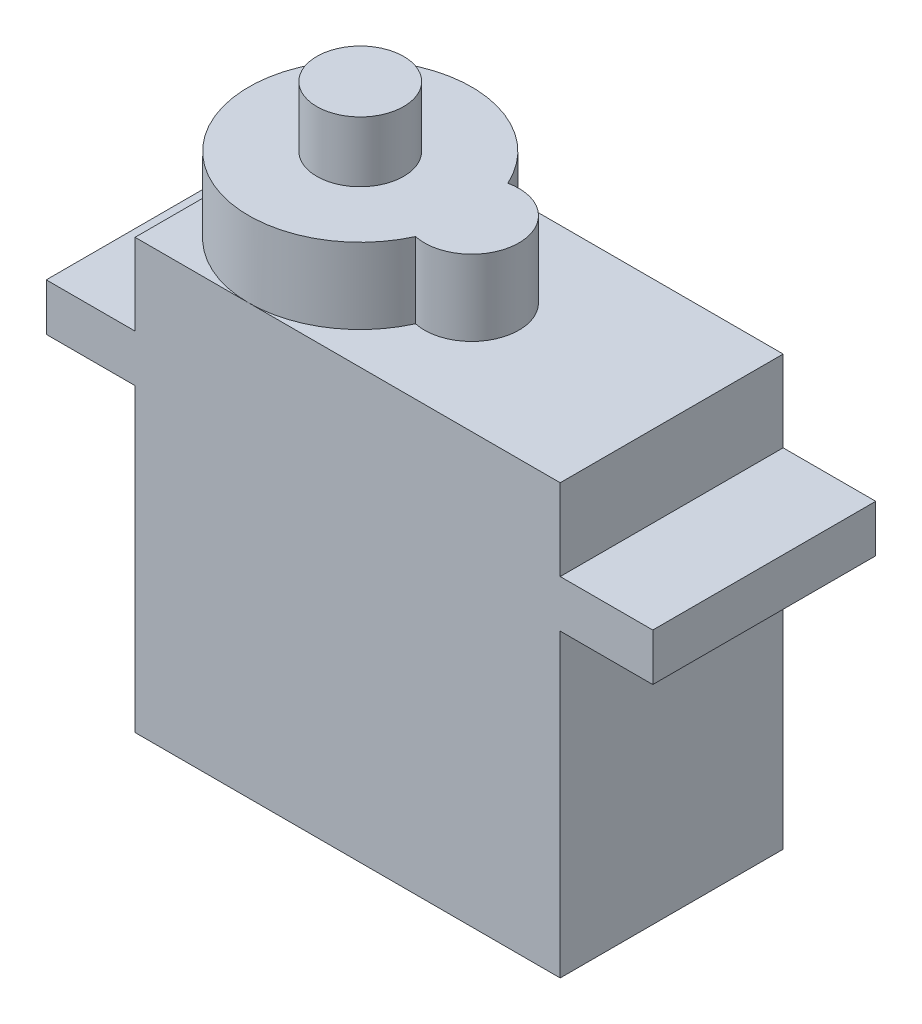
ISO-10303-21;
HEADER;
FILE_DESCRIPTION(('STEP AP214'),'2;1');
FILE_NAME('part.step','',(''),(''),'','','');
FILE_SCHEMA(('AUTOMOTIVE_DESIGN { 1 0 10303 214 1 1 1 1 }'));
ENDSEC;
DATA;
#1=APPLICATION_CONTEXT('core data for automotive mechanical design processes');
#2=APPLICATION_PROTOCOL_DEFINITION('international standard','automotive_design',2000,#1);
#3=PRODUCT_CONTEXT('',#1,'mechanical');
#4=PRODUCT('Part','Part','',(#3));
#5=PRODUCT_RELATED_PRODUCT_CATEGORY('part','',(#4));
#6=PRODUCT_DEFINITION_FORMATION('','',#4);
#7=PRODUCT_DEFINITION_CONTEXT('part definition',#1,'design');
#8=PRODUCT_DEFINITION('design','',#6,#7);
#9=PRODUCT_DEFINITION_SHAPE('','',#8);
#10=(LENGTH_UNIT() NAMED_UNIT(*) SI_UNIT(.MILLI.,.METRE.));
#11=(NAMED_UNIT(*) PLANE_ANGLE_UNIT() SI_UNIT($,.RADIAN.));
#12=(NAMED_UNIT(*) SI_UNIT($,.STERADIAN.) SOLID_ANGLE_UNIT());
#13=UNCERTAINTY_MEASURE_WITH_UNIT(LENGTH_MEASURE(1.E-05),#10,'distance_accuracy_value','');
#14=(GEOMETRIC_REPRESENTATION_CONTEXT(3) GLOBAL_UNCERTAINTY_ASSIGNED_CONTEXT((#13)) GLOBAL_UNIT_ASSIGNED_CONTEXT((#10,
#11,#12)) REPRESENTATION_CONTEXT('',''));
#15=CARTESIAN_POINT('',(0.,0.,0.));
#16=DIRECTION('',(0.,0.,1.));
#17=DIRECTION('',(1.,0.,0.));
#18=AXIS2_PLACEMENT_3D('',#15,#16,#17);
#19=CARTESIAN_POINT('',(0.,22.7,0.));
#20=DIRECTION('',(0.,-1.,0.));
#21=DIRECTION('',(0.,0.,-1.));
#22=AXIS2_PLACEMENT_3D('',#19,#20,#21);
#23=PLANE('',#22);
#24=CARTESIAN_POINT('',(0.667386713212539,22.7,0.));
#25=DIRECTION('',(0.,1.,0.));
#26=DIRECTION('',(0.,0.,1.));
#27=AXIS2_PLACEMENT_3D('',#24,#25,#26);
#28=CIRCLE('',#27,2.5);
#29=CARTESIAN_POINT('',(0.137725696263387,22.7,2.44324767617292));
#30=VERTEX_POINT('',#29);
#31=CARTESIAN_POINT('',(0.137725696263387,22.7,-2.44324767617292));
#32=VERTEX_POINT('',#31);
#33=EDGE_CURVE('E171',#30,#32,#28,.T.);
#34=ORIENTED_EDGE('',*,*,#33,.F.);
#35=CARTESIAN_POINT('',(-5.23261328678746,22.7,0.));
#36=DIRECTION('',(0.,1.,0.));
#37=DIRECTION('',(0.,0.,1.));
#38=AXIS2_PLACEMENT_3D('',#35,#36,#37);
#39=CIRCLE('',#38,5.9);
#40=CARTESIAN_POINT('',(-5.23261328678746,22.7,5.9));
#41=VERTEX_POINT('',#40);
#42=EDGE_CURVE('E53',#41,#30,#39,.T.);
#43=ORIENTED_EDGE('',*,*,#42,.F.);
#44=DIRECTION('',(1.,0.,0.));
#45=VECTOR('',#44,1.);
#46=CARTESIAN_POINT('',(11.25,22.7,5.9));
#47=LINE('',#46,#45);
#48=CARTESIAN_POINT('',(11.25,22.7,5.9));
#49=VERTEX_POINT('',#48);
#50=EDGE_CURVE('E248',#41,#49,#47,.T.);
#51=ORIENTED_EDGE('',*,*,#50,.T.);
#52=DIRECTION('',(0.,0.,-1.));
#53=VECTOR('',#52,1.);
#54=CARTESIAN_POINT('',(11.25,22.7,-5.9));
#55=LINE('',#54,#53);
#56=CARTESIAN_POINT('',(11.25,22.7,-5.9));
#57=VERTEX_POINT('',#56);
#58=EDGE_CURVE('E253',#49,#57,#55,.T.);
#59=ORIENTED_EDGE('',*,*,#58,.T.);
#60=DIRECTION('',(-1.,0.,0.));
#61=VECTOR('',#60,1.);
#62=CARTESIAN_POINT('',(11.25,22.7,-5.9));
#63=LINE('',#62,#61);
#64=CARTESIAN_POINT('',(-5.23261328678746,22.7,-5.9));
#65=VERTEX_POINT('',#64);
#66=EDGE_CURVE('E257',#57,#65,#63,.T.);
#67=ORIENTED_EDGE('',*,*,#66,.T.);
#68=EDGE_CURVE('E55',#32,#65,#39,.T.);
#69=ORIENTED_EDGE('',*,*,#68,.F.);
#70=EDGE_LOOP('',(#34,#43,#51,#59,#67,#69));
#71=FACE_BOUND('',#70,.T.);
#72=ADVANCED_FACE('F43',(#71),#23,.F.);
#73=CARTESIAN_POINT('',(-11.25,22.7,-5.9));
#74=DIRECTION('',(1.,0.,0.));
#75=DIRECTION('',(0.,0.,-1.));
#76=AXIS2_PLACEMENT_3D('',#73,#74,#75);
#77=PLANE('',#76);
#78=DIRECTION('',(0.,-1.,0.));
#79=VECTOR('',#78,1.);
#80=CARTESIAN_POINT('',(-11.25,22.7,-5.9));
#81=LINE('',#80,#79);
#82=CARTESIAN_POINT('',(-11.25,22.7,-5.9));
#83=VERTEX_POINT('',#82);
#84=CARTESIAN_POINT('',(-11.25,18.4,-5.9));
#85=VERTEX_POINT('',#84);
#86=EDGE_CURVE('E275',#83,#85,#81,.T.);
#87=ORIENTED_EDGE('',*,*,#86,.T.);
#88=DIRECTION('',(0.,0.,1.));
#89=VECTOR('',#88,1.);
#90=CARTESIAN_POINT('',(-11.25,18.4,-5.9));
#91=LINE('',#90,#89);
#92=CARTESIAN_POINT('',(-11.25,18.4,5.9));
#93=VERTEX_POINT('',#92);
#94=EDGE_CURVE('E239',#85,#93,#91,.T.);
#95=ORIENTED_EDGE('',*,*,#94,.T.);
#96=DIRECTION('',(0.,-1.,0.));
#97=VECTOR('',#96,1.);
#98=CARTESIAN_POINT('',(-11.25,22.7,5.9));
#99=LINE('',#98,#97);
#100=CARTESIAN_POINT('',(-11.25,22.7,5.9));
#101=VERTEX_POINT('',#100);
#102=EDGE_CURVE('E47',#101,#93,#99,.T.);
#103=ORIENTED_EDGE('',*,*,#102,.F.);
#104=DIRECTION('',(0.,0.,1.));
#105=VECTOR('',#104,1.);
#106=CARTESIAN_POINT('',(-11.25,22.7,-5.9));
#107=LINE('',#106,#105);
#108=EDGE_CURVE('E244',#83,#101,#107,.T.);
#109=ORIENTED_EDGE('',*,*,#108,.F.);
#110=EDGE_LOOP('',(#87,#95,#103,#109));
#111=FACE_BOUND('',#110,.T.);
#112=ADVANCED_FACE('F332',(#111),#77,.F.);
#113=CARTESIAN_POINT('',(11.25,22.7,-5.9));
#114=DIRECTION('',(-1.,0.,0.));
#115=DIRECTION('',(0.,0.,1.));
#116=AXIS2_PLACEMENT_3D('',#113,#114,#115);
#117=PLANE('',#116);
#118=DIRECTION('',(0.,-1.,0.));
#119=VECTOR('',#118,1.);
#120=CARTESIAN_POINT('',(11.25,22.7,5.9));
#121=LINE('',#120,#119);
#122=CARTESIAN_POINT('',(11.25,18.4,5.9));
#123=VERTEX_POINT('',#122);
#124=EDGE_CURVE('E284',#49,#123,#121,.T.);
#125=ORIENTED_EDGE('',*,*,#124,.T.);
#126=DIRECTION('',(0.,0.,-1.));
#127=VECTOR('',#126,1.);
#128=CARTESIAN_POINT('',(11.25,18.4,-5.9));
#129=LINE('',#128,#127);
#130=CARTESIAN_POINT('',(11.25,18.4,-5.9));
#131=VERTEX_POINT('',#130);
#132=EDGE_CURVE('E235',#123,#131,#129,.T.);
#133=ORIENTED_EDGE('',*,*,#132,.T.);
#134=DIRECTION('',(0.,-1.,0.));
#135=VECTOR('',#134,1.);
#136=CARTESIAN_POINT('',(11.25,22.7,-5.9));
#137=LINE('',#136,#135);
#138=EDGE_CURVE('E280',#57,#131,#137,.T.);
#139=ORIENTED_EDGE('',*,*,#138,.F.);
#140=ORIENTED_EDGE('',*,*,#58,.F.);
#141=EDGE_LOOP('',(#125,#133,#139,#140));
#142=FACE_BOUND('',#141,.T.);
#143=ADVANCED_FACE('F345',(#142),#117,.F.);
#144=CARTESIAN_POINT('',(-11.25,15.9,5.9));
#145=VERTEX_POINT('',#144);
#146=CARTESIAN_POINT('',(-11.25,0.,5.9));
#147=VERTEX_POINT('',#146);
#148=EDGE_CURVE('E287',#145,#147,#99,.T.);
#149=ORIENTED_EDGE('',*,*,#148,.F.);
#150=DIRECTION('',(0.,0.,-1.));
#151=VECTOR('',#150,1.);
#152=CARTESIAN_POINT('',(-11.25,15.9,-5.9));
#153=LINE('',#152,#151);
#154=CARTESIAN_POINT('',(-11.25,15.9,-5.9));
#155=VERTEX_POINT('',#154);
#156=EDGE_CURVE('E231',#145,#155,#153,.T.);
#157=ORIENTED_EDGE('',*,*,#156,.T.);
#158=CARTESIAN_POINT('',(-11.25,0.,-5.9));
#159=VERTEX_POINT('',#158);
#160=EDGE_CURVE('E260',#155,#159,#81,.T.);
#161=ORIENTED_EDGE('',*,*,#160,.T.);
#162=DIRECTION('',(0.,0.,1.));
#163=VECTOR('',#162,1.);
#164=CARTESIAN_POINT('',(-11.25,0.,-5.9));
#165=LINE('',#164,#163);
#166=EDGE_CURVE('E243',#159,#147,#165,.T.);
#167=ORIENTED_EDGE('',*,*,#166,.T.);
#168=EDGE_LOOP('',(#149,#157,#161,#167));
#169=FACE_BOUND('',#168,.T.);
#170=ADVANCED_FACE('F45',(#169),#77,.F.);
#171=CARTESIAN_POINT('',(11.25,22.7,5.9));
#172=DIRECTION('',(0.,0.,-1.));
#173=DIRECTION('',(-1.,0.,0.));
#174=AXIS2_PLACEMENT_3D('',#171,#172,#173);
#175=PLANE('',#174);
#176=CARTESIAN_POINT('',(11.25,15.9,5.9));
#177=VERTEX_POINT('',#176);
#178=CARTESIAN_POINT('',(11.25,0.,5.9));
#179=VERTEX_POINT('',#178);
#180=EDGE_CURVE('E283',#177,#179,#121,.T.);
#181=ORIENTED_EDGE('',*,*,#180,.F.);
#182=DIRECTION('',(-1.,0.,0.));
#183=VECTOR('',#182,1.);
#184=CARTESIAN_POINT('',(16.15,15.9,5.9));
#185=LINE('',#184,#183);
#186=CARTESIAN_POINT('',(16.15,15.9,5.9));
#187=VERTEX_POINT('',#186);
#188=EDGE_CURVE('E220',#187,#177,#185,.T.);
#189=ORIENTED_EDGE('',*,*,#188,.F.);
#190=DIRECTION('',(0.,1.,0.));
#191=VECTOR('',#190,1.);
#192=CARTESIAN_POINT('',(16.15,18.4,5.9));
#193=LINE('',#192,#191);
#194=CARTESIAN_POINT('',(16.15,18.4,5.9));
#195=VERTEX_POINT('',#194);
#196=EDGE_CURVE('E201',#187,#195,#193,.T.);
#197=ORIENTED_EDGE('',*,*,#196,.T.);
#198=DIRECTION('',(-1.,0.,0.));
#199=VECTOR('',#198,1.);
#200=CARTESIAN_POINT('',(16.15,18.4,5.9));
#201=LINE('',#200,#199);
#202=EDGE_CURVE('E215',#195,#123,#201,.T.);
#203=ORIENTED_EDGE('',*,*,#202,.T.);
#204=ORIENTED_EDGE('',*,*,#124,.F.);
#205=ORIENTED_EDGE('',*,*,#50,.F.);
#206=EDGE_CURVE('E250',#101,#41,#47,.T.);
#207=ORIENTED_EDGE('',*,*,#206,.F.);
#208=ORIENTED_EDGE('',*,*,#102,.T.);
#209=CARTESIAN_POINT('',(-15.95,18.4,5.9));
#210=VERTEX_POINT('',#209);
#211=EDGE_CURVE('E219',#93,#210,#201,.T.);
#212=ORIENTED_EDGE('',*,*,#211,.T.);
#213=DIRECTION('',(0.,1.,0.));
#214=VECTOR('',#213,1.);
#215=CARTESIAN_POINT('',(-15.95,18.4,5.9));
#216=LINE('',#215,#214);
#217=CARTESIAN_POINT('',(-15.95,15.9,5.9));
#218=VERTEX_POINT('',#217);
#219=EDGE_CURVE('E185',#218,#210,#216,.T.);
#220=ORIENTED_EDGE('',*,*,#219,.F.);
#221=EDGE_CURVE('E223',#145,#218,#185,.T.);
#222=ORIENTED_EDGE('',*,*,#221,.F.);
#223=ORIENTED_EDGE('',*,*,#148,.T.);
#224=DIRECTION('',(1.,0.,0.));
#225=VECTOR('',#224,1.);
#226=CARTESIAN_POINT('',(11.25,0.,5.9));
#227=LINE('',#226,#225);
#228=EDGE_CURVE('E264',#147,#179,#227,.T.);
#229=ORIENTED_EDGE('',*,*,#228,.T.);
#230=EDGE_LOOP('',(#181,#189,#197,#203,#204,#205,#207,#208,#212,#220,#222,#223,#229));
#231=FACE_BOUND('',#230,.T.);
#232=ADVANCED_FACE('F301',(#231),#175,.F.);
#233=CARTESIAN_POINT('',(11.25,15.9,-5.9));
#234=VERTEX_POINT('',#233);
#235=CARTESIAN_POINT('',(11.25,0.,-5.9));
#236=VERTEX_POINT('',#235);
#237=EDGE_CURVE('E279',#234,#236,#137,.T.);
#238=ORIENTED_EDGE('',*,*,#237,.F.);
#239=DIRECTION('',(0.,0.,1.));
#240=VECTOR('',#239,1.);
#241=CARTESIAN_POINT('',(11.25,15.9,-5.9));
#242=LINE('',#241,#240);
#243=EDGE_CURVE('E213',#234,#177,#242,.T.);
#244=ORIENTED_EDGE('',*,*,#243,.T.);
#245=ORIENTED_EDGE('',*,*,#180,.T.);
#246=DIRECTION('',(0.,0.,-1.));
#247=VECTOR('',#246,1.);
#248=CARTESIAN_POINT('',(11.25,0.,-5.9));
#249=LINE('',#248,#247);
#250=EDGE_CURVE('E268',#179,#236,#249,.T.);
#251=ORIENTED_EDGE('',*,*,#250,.T.);
#252=EDGE_LOOP('',(#238,#244,#245,#251));
#253=FACE_BOUND('',#252,.T.);
#254=ADVANCED_FACE('F296',(#253),#117,.F.);
#255=CARTESIAN_POINT('',(11.25,22.7,-5.9));
#256=DIRECTION('',(0.,0.,1.));
#257=DIRECTION('',(1.,0.,0.));
#258=AXIS2_PLACEMENT_3D('',#255,#256,#257);
#259=PLANE('',#258);
#260=ORIENTED_EDGE('',*,*,#160,.F.);
#261=DIRECTION('',(-1.,0.,0.));
#262=VECTOR('',#261,1.);
#263=CARTESIAN_POINT('',(16.15,15.9,-5.9));
#264=LINE('',#263,#262);
#265=CARTESIAN_POINT('',(-15.95,15.9,-5.9));
#266=VERTEX_POINT('',#265);
#267=EDGE_CURVE('E209',#155,#266,#264,.T.);
#268=ORIENTED_EDGE('',*,*,#267,.T.);
#269=DIRECTION('',(0.,-1.,0.));
#270=VECTOR('',#269,1.);
#271=CARTESIAN_POINT('',(-15.95,18.4,-5.9));
#272=LINE('',#271,#270);
#273=CARTESIAN_POINT('',(-15.95,18.4,-5.9));
#274=VERTEX_POINT('',#273);
#275=EDGE_CURVE('E173',#274,#266,#272,.T.);
#276=ORIENTED_EDGE('',*,*,#275,.F.);
#277=DIRECTION('',(-1.,0.,0.));
#278=VECTOR('',#277,1.);
#279=CARTESIAN_POINT('',(16.15,18.4,-5.9));
#280=LINE('',#279,#278);
#281=EDGE_CURVE('E214',#85,#274,#280,.T.);
#282=ORIENTED_EDGE('',*,*,#281,.F.);
#283=ORIENTED_EDGE('',*,*,#86,.F.);
#284=EDGE_CURVE('E256',#65,#83,#63,.T.);
#285=ORIENTED_EDGE('',*,*,#284,.F.);
#286=ORIENTED_EDGE('',*,*,#66,.F.);
#287=ORIENTED_EDGE('',*,*,#138,.T.);
#288=CARTESIAN_POINT('',(16.15,18.4,-5.9));
#289=VERTEX_POINT('',#288);
#290=EDGE_CURVE('E210',#289,#131,#280,.T.);
#291=ORIENTED_EDGE('',*,*,#290,.F.);
#292=DIRECTION('',(0.,-1.,0.));
#293=VECTOR('',#292,1.);
#294=CARTESIAN_POINT('',(16.15,18.4,-5.9));
#295=LINE('',#294,#293);
#296=CARTESIAN_POINT('',(16.15,15.9,-5.9));
#297=VERTEX_POINT('',#296);
#298=EDGE_CURVE('E193',#289,#297,#295,.T.);
#299=ORIENTED_EDGE('',*,*,#298,.T.);
#300=EDGE_CURVE('E224',#297,#234,#264,.T.);
#301=ORIENTED_EDGE('',*,*,#300,.T.);
#302=ORIENTED_EDGE('',*,*,#237,.T.);
#303=DIRECTION('',(-1.,0.,0.));
#304=VECTOR('',#303,1.);
#305=CARTESIAN_POINT('',(11.25,0.,-5.9));
#306=LINE('',#305,#304);
#307=EDGE_CURVE('E249',#236,#159,#306,.T.);
#308=ORIENTED_EDGE('',*,*,#307,.T.);
#309=EDGE_LOOP('',(#260,#268,#276,#282,#283,#285,#286,#287,#291,#299,#301,#302,#308));
#310=FACE_BOUND('',#309,.T.);
#311=ADVANCED_FACE('F309',(#310),#259,.F.);
#312=EDGE_CURVE('E11',#65,#41,#39,.T.);
#313=ORIENTED_EDGE('',*,*,#312,.F.);
#314=ORIENTED_EDGE('',*,*,#284,.T.);
#315=ORIENTED_EDGE('',*,*,#108,.T.);
#316=ORIENTED_EDGE('',*,*,#206,.T.);
#317=EDGE_LOOP('',(#313,#314,#315,#316));
#318=FACE_BOUND('',#317,.T.);
#319=ADVANCED_FACE('F335',(#318),#23,.F.);
#320=CARTESIAN_POINT('',(0.,0.,0.));
#321=DIRECTION('',(0.,-1.,0.));
#322=DIRECTION('',(0.,0.,-1.));
#323=AXIS2_PLACEMENT_3D('',#320,#321,#322);
#324=PLANE('',#323);
#325=ORIENTED_EDGE('',*,*,#166,.F.);
#326=ORIENTED_EDGE('',*,*,#307,.F.);
#327=ORIENTED_EDGE('',*,*,#250,.F.);
#328=ORIENTED_EDGE('',*,*,#228,.F.);
#329=EDGE_LOOP('',(#325,#326,#327,#328));
#330=FACE_BOUND('',#329,.T.);
#331=ADVANCED_FACE('F306',(#330),#324,.T.);
#332=CARTESIAN_POINT('',(16.15,0.,0.));
#333=DIRECTION('',(-1.,0.,0.));
#334=DIRECTION('',(0.,0.,1.));
#335=AXIS2_PLACEMENT_3D('',#332,#333,#334);
#336=PLANE('',#335);
#337=ORIENTED_EDGE('',*,*,#298,.F.);
#338=DIRECTION('',(0.,0.,-1.));
#339=VECTOR('',#338,1.);
#340=CARTESIAN_POINT('',(16.15,18.4,-5.9));
#341=LINE('',#340,#339);
#342=EDGE_CURVE('E205',#195,#289,#341,.T.);
#343=ORIENTED_EDGE('',*,*,#342,.F.);
#344=ORIENTED_EDGE('',*,*,#196,.F.);
#345=DIRECTION('',(0.,0.,1.));
#346=VECTOR('',#345,1.);
#347=CARTESIAN_POINT('',(16.15,15.9,-5.9));
#348=LINE('',#347,#346);
#349=EDGE_CURVE('E197',#297,#187,#348,.T.);
#350=ORIENTED_EDGE('',*,*,#349,.F.);
#351=EDGE_LOOP('',(#337,#343,#344,#350));
#352=FACE_BOUND('',#351,.T.);
#353=ADVANCED_FACE('F351',(#352),#336,.F.);
#354=CARTESIAN_POINT('',(16.15,15.9,-5.9));
#355=DIRECTION('',(0.,-1.,0.));
#356=DIRECTION('',(0.,0.,-1.));
#357=AXIS2_PLACEMENT_3D('',#354,#355,#356);
#358=PLANE('',#357);
#359=ORIENTED_EDGE('',*,*,#243,.F.);
#360=ORIENTED_EDGE('',*,*,#300,.F.);
#361=ORIENTED_EDGE('',*,*,#349,.T.);
#362=ORIENTED_EDGE('',*,*,#188,.T.);
#363=EDGE_LOOP('',(#359,#360,#361,#362));
#364=FACE_BOUND('',#363,.T.);
#365=ADVANCED_FACE('F355',(#364),#358,.T.);
#366=CARTESIAN_POINT('',(16.15,18.4,-5.9));
#367=DIRECTION('',(0.,1.,0.));
#368=DIRECTION('',(0.,0.,1.));
#369=AXIS2_PLACEMENT_3D('',#366,#367,#368);
#370=PLANE('',#369);
#371=ORIENTED_EDGE('',*,*,#132,.F.);
#372=ORIENTED_EDGE('',*,*,#202,.F.);
#373=ORIENTED_EDGE('',*,*,#342,.T.);
#374=ORIENTED_EDGE('',*,*,#290,.T.);
#375=EDGE_LOOP('',(#371,#372,#373,#374));
#376=FACE_BOUND('',#375,.T.);
#377=ADVANCED_FACE('F353',(#376),#370,.T.);
#378=ORIENTED_EDGE('',*,*,#94,.F.);
#379=ORIENTED_EDGE('',*,*,#281,.T.);
#380=DIRECTION('',(0.,0.,-1.));
#381=VECTOR('',#380,1.);
#382=CARTESIAN_POINT('',(-15.95,18.4,-5.9));
#383=LINE('',#382,#381);
#384=EDGE_CURVE('E189',#210,#274,#383,.T.);
#385=ORIENTED_EDGE('',*,*,#384,.F.);
#386=ORIENTED_EDGE('',*,*,#211,.F.);
#387=EDGE_LOOP('',(#378,#379,#385,#386));
#388=FACE_BOUND('',#387,.T.);
#389=ADVANCED_FACE('F328',(#388),#370,.T.);
#390=ORIENTED_EDGE('',*,*,#156,.F.);
#391=ORIENTED_EDGE('',*,*,#221,.T.);
#392=DIRECTION('',(0.,0.,1.));
#393=VECTOR('',#392,1.);
#394=CARTESIAN_POINT('',(-15.95,15.9,-5.9));
#395=LINE('',#394,#393);
#396=EDGE_CURVE('E178',#266,#218,#395,.T.);
#397=ORIENTED_EDGE('',*,*,#396,.F.);
#398=ORIENTED_EDGE('',*,*,#267,.F.);
#399=EDGE_LOOP('',(#390,#391,#397,#398));
#400=FACE_BOUND('',#399,.T.);
#401=ADVANCED_FACE('F322',(#400),#358,.T.);
#402=CARTESIAN_POINT('',(-15.95,0.,0.));
#403=DIRECTION('',(-1.,0.,0.));
#404=DIRECTION('',(0.,0.,1.));
#405=AXIS2_PLACEMENT_3D('',#402,#403,#404);
#406=PLANE('',#405);
#407=ORIENTED_EDGE('',*,*,#275,.T.);
#408=ORIENTED_EDGE('',*,*,#396,.T.);
#409=ORIENTED_EDGE('',*,*,#219,.T.);
#410=ORIENTED_EDGE('',*,*,#384,.T.);
#411=EDGE_LOOP('',(#407,#408,#409,#410));
#412=FACE_BOUND('',#411,.T.);
#413=ADVANCED_FACE('F325',(#412),#406,.T.);
#414=CARTESIAN_POINT('',(0.667386713212539,26.7,0.));
#415=DIRECTION('',(0.,-1.,0.));
#416=DIRECTION('',(0.,0.,-1.));
#417=AXIS2_PLACEMENT_3D('',#414,#415,#416);
#418=CYLINDRICAL_SURFACE('',#417,2.5);
#419=ORIENTED_EDGE('',*,*,#33,.T.);
#420=DIRECTION('',(0.,-1.,0.));
#421=VECTOR('',#420,1.);
#422=CARTESIAN_POINT('',(0.137725696263387,26.7,-2.44324767617292));
#423=LINE('',#422,#421);
#424=CARTESIAN_POINT('',(0.137725696263387,26.7,-2.44324767617292));
#425=VERTEX_POINT('',#424);
#426=EDGE_CURVE('E156',#425,#32,#423,.T.);
#427=ORIENTED_EDGE('',*,*,#426,.F.);
#428=CARTESIAN_POINT('',(0.667386713212539,26.7,0.));
#429=DIRECTION('',(0.,1.,0.));
#430=DIRECTION('',(0.,0.,1.));
#431=AXIS2_PLACEMENT_3D('',#428,#429,#430);
#432=CIRCLE('',#431,2.5);
#433=CARTESIAN_POINT('',(0.137725696263387,26.7,2.44324767617292));
#434=VERTEX_POINT('',#433);
#435=EDGE_CURVE('E164',#434,#425,#432,.T.);
#436=ORIENTED_EDGE('',*,*,#435,.F.);
#437=DIRECTION('',(0.,-1.,0.));
#438=VECTOR('',#437,1.);
#439=CARTESIAN_POINT('',(0.137725696263387,26.7,2.44324767617292));
#440=LINE('',#439,#438);
#441=EDGE_CURVE('E160',#434,#30,#440,.T.);
#442=ORIENTED_EDGE('',*,*,#441,.T.);
#443=EDGE_LOOP('',(#419,#427,#436,#442));
#444=FACE_BOUND('',#443,.T.);
#445=ADVANCED_FACE('F170',(#444),#418,.T.);
#446=CARTESIAN_POINT('',(-5.23261328678746,26.7,0.));
#447=DIRECTION('',(0.,-1.,0.));
#448=DIRECTION('',(0.,0.,-1.));
#449=AXIS2_PLACEMENT_3D('',#446,#447,#448);
#450=CYLINDRICAL_SURFACE('',#449,5.9);
#451=ORIENTED_EDGE('',*,*,#68,.T.);
#452=ORIENTED_EDGE('',*,*,#312,.T.);
#453=ORIENTED_EDGE('',*,*,#42,.T.);
#454=ORIENTED_EDGE('',*,*,#441,.F.);
#455=CARTESIAN_POINT('',(-5.23261328678746,26.7,0.));
#456=DIRECTION('',(0.,1.,0.));
#457=DIRECTION('',(0.,0.,1.));
#458=AXIS2_PLACEMENT_3D('',#455,#456,#457);
#459=CIRCLE('',#458,5.9);
#460=EDGE_CURVE('E152',#425,#434,#459,.T.);
#461=ORIENTED_EDGE('',*,*,#460,.F.);
#462=ORIENTED_EDGE('',*,*,#426,.T.);
#463=EDGE_LOOP('',(#451,#452,#453,#454,#461,#462));
#464=FACE_BOUND('',#463,.T.);
#465=ADVANCED_FACE('F154',(#464),#450,.T.);
#466=CARTESIAN_POINT('',(-2.28261328678746,26.7,0.));
#467=DIRECTION('',(0.,1.,0.));
#468=DIRECTION('',(0.,0.,1.));
#469=AXIS2_PLACEMENT_3D('',#466,#467,#468);
#470=PLANE('',#469);
#471=CARTESIAN_POINT('',(-5.23261328678744,26.7,0.));
#472=DIRECTION('',(0.,1.,0.));
#473=DIRECTION('',(0.,0.,1.));
#474=AXIS2_PLACEMENT_3D('',#471,#472,#473);
#475=CIRCLE('',#474,2.3);
#476=CARTESIAN_POINT('',(-5.23261328678744,26.7,2.3));
#477=VERTEX_POINT('',#476);
#478=EDGE_CURVE('E530',#477,#477,#475,.T.);
#479=ORIENTED_EDGE('',*,*,#478,.F.);
#480=EDGE_LOOP('',(#479));
#481=FACE_BOUND('',#480,.T.);
#482=ORIENTED_EDGE('',*,*,#435,.T.);
#483=ORIENTED_EDGE('',*,*,#460,.T.);
#484=EDGE_LOOP('',(#482,#483));
#485=FACE_BOUND('',#484,.T.);
#486=ADVANCED_FACE('F166',(#481,#485),#470,.T.);
#487=CARTESIAN_POINT('',(-5.23261328678744,29.9,0.));
#488=DIRECTION('',(0.,-1.,0.));
#489=DIRECTION('',(0.,0.,-1.));
#490=AXIS2_PLACEMENT_3D('',#487,#488,#489);
#491=CYLINDRICAL_SURFACE('',#490,2.3);
#492=CARTESIAN_POINT('',(-5.23261328678744,29.9,0.));
#493=DIRECTION('',(0.,1.,0.));
#494=DIRECTION('',(0.,0.,1.));
#495=AXIS2_PLACEMENT_3D('',#492,#493,#494);
#496=CIRCLE('',#495,2.3);
#497=CARTESIAN_POINT('',(-5.23261328678744,29.9,2.3));
#498=VERTEX_POINT('',#497);
#499=EDGE_CURVE('E340',#498,#498,#496,.T.);
#500=ORIENTED_EDGE('',*,*,#499,.F.);
#501=EDGE_LOOP('',(#500));
#502=FACE_BOUND('',#501,.T.);
#503=ORIENTED_EDGE('',*,*,#478,.T.);
#504=EDGE_LOOP('',(#503));
#505=FACE_BOUND('',#504,.T.);
#506=ADVANCED_FACE('F495',(#502,#505),#491,.T.);
#507=CARTESIAN_POINT('',(-5.23261328678744,29.9,0.));
#508=DIRECTION('',(0.,1.,0.));
#509=DIRECTION('',(0.,0.,1.));
#510=AXIS2_PLACEMENT_3D('',#507,#508,#509);
#511=PLANE('',#510);
#512=ORIENTED_EDGE('',*,*,#499,.T.);
#513=EDGE_LOOP('',(#512));
#514=FACE_BOUND('',#513,.T.);
#515=ADVANCED_FACE('F506',(#514),#511,.T.);
#516=CLOSED_SHELL('',(#72,#112,#143,#170,#232,#254,#311,#319,#331,#353,#365,#377,#389,#401,#413,
#445,#465,#486,#506,#515));
#517=MANIFOLD_SOLID_BREP('B2',#516);
#518=ADVANCED_BREP_SHAPE_REPRESENTATION('',(#18,#517),#14);
#519=SHAPE_DEFINITION_REPRESENTATION(#9,#518);
ENDSEC;
END-ISO-10303-21;
